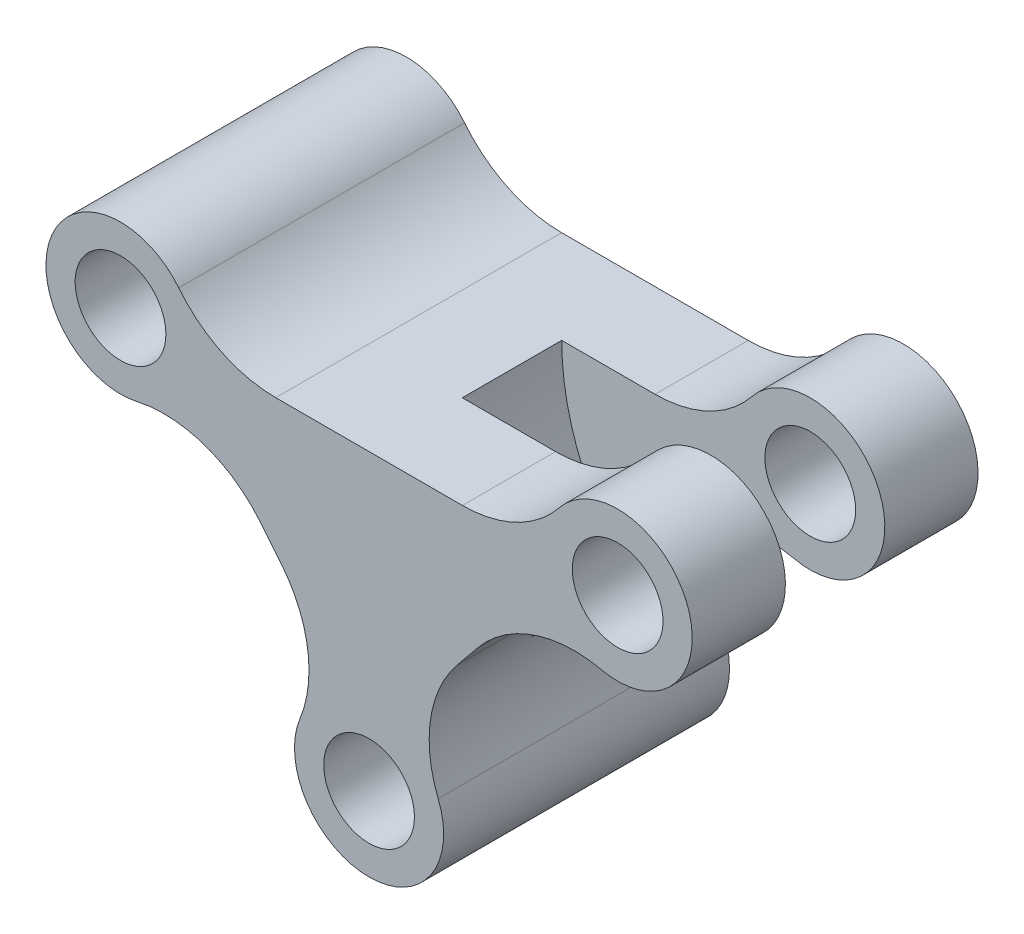
ISO-10303-21;
HEADER;
FILE_DESCRIPTION(('STEP AP214'),'2;1');
FILE_NAME('part.step','',(''),(''),'','','');
FILE_SCHEMA(('AUTOMOTIVE_DESIGN { 1 0 10303 214 1 1 1 1 }'));
ENDSEC;
DATA;
#1=APPLICATION_CONTEXT('core data for automotive mechanical design processes');
#2=APPLICATION_PROTOCOL_DEFINITION('international standard','automotive_design',2000,#1);
#3=PRODUCT_CONTEXT('',#1,'mechanical');
#4=PRODUCT('Part','Part','',(#3));
#5=PRODUCT_RELATED_PRODUCT_CATEGORY('part','',(#4));
#6=PRODUCT_DEFINITION_FORMATION('','',#4);
#7=PRODUCT_DEFINITION_CONTEXT('part definition',#1,'design');
#8=PRODUCT_DEFINITION('design','',#6,#7);
#9=PRODUCT_DEFINITION_SHAPE('','',#8);
#10=(LENGTH_UNIT() NAMED_UNIT(*) SI_UNIT(.MILLI.,.METRE.));
#11=(NAMED_UNIT(*) PLANE_ANGLE_UNIT() SI_UNIT($,.RADIAN.));
#12=(NAMED_UNIT(*) SI_UNIT($,.STERADIAN.) SOLID_ANGLE_UNIT());
#13=UNCERTAINTY_MEASURE_WITH_UNIT(LENGTH_MEASURE(1.E-05),#10,'distance_accuracy_value','');
#14=(GEOMETRIC_REPRESENTATION_CONTEXT(3) GLOBAL_UNCERTAINTY_ASSIGNED_CONTEXT((#13)) GLOBAL_UNIT_ASSIGNED_CONTEXT((#10,
#11,#12)) REPRESENTATION_CONTEXT('',''));
#15=CARTESIAN_POINT('',(0.,0.,0.));
#16=DIRECTION('',(0.,0.,1.));
#17=DIRECTION('',(1.,0.,0.));
#18=AXIS2_PLACEMENT_3D('',#15,#16,#17);
#19=CARTESIAN_POINT('',(2.45008972423379,-2.00294834956112,11.5));
#20=DIRECTION('',(0.774215945384604,-0.632921535351914,0.));
#21=DIRECTION('',(0.632921535351914,0.774215945384604,0.));
#22=AXIS2_PLACEMENT_3D('',#19,#20,#21);
#23=PLANE('',#22);
#24=DIRECTION('',(-0.632921535351914,-0.774215945384604,0.));
#25=VECTOR('',#24,1.);
#26=CARTESIAN_POINT('',(2.45008972423379,-2.00294834956112,7.75));
#27=LINE('',#26,#25);
#28=CARTESIAN_POINT('',(4.38022113462885,0.358068666212658,7.75));
#29=VERTEX_POINT('',#28);
#30=CARTESIAN_POINT('',(3.54594958364345,-0.662446992485075,7.75));
#31=VERTEX_POINT('',#30);
#32=EDGE_CURVE('E549',#29,#31,#27,.T.);
#33=ORIENTED_EDGE('',*,*,#32,.F.);
#34=DIRECTION('',(0.,0.,-1.));
#35=VECTOR('',#34,1.);
#36=CARTESIAN_POINT('',(4.38022113462885,0.358068666212658,11.5));
#37=LINE('',#36,#35);
#38=CARTESIAN_POINT('',(4.38022113462885,0.358068666212658,11.5));
#39=VERTEX_POINT('',#38);
#40=EDGE_CURVE('E429',#29,#39,#37,.F.);
#41=ORIENTED_EDGE('',*,*,#40,.T.);
#42=DIRECTION('',(-0.632921535351914,-0.774215945384604,0.));
#43=VECTOR('',#42,1.);
#44=CARTESIAN_POINT('',(2.45008972423379,-2.00294834956112,11.5));
#45=LINE('',#44,#43);
#46=CARTESIAN_POINT('',(3.54594958364345,-0.662446992485075,11.5));
#47=VERTEX_POINT('',#46);
#48=EDGE_CURVE('E520',#39,#47,#45,.T.);
#49=ORIENTED_EDGE('',*,*,#48,.T.);
#50=DIRECTION('',(0.,0.,-1.));
#51=VECTOR('',#50,1.);
#52=CARTESIAN_POINT('',(3.54594958364345,-0.662446992485075,11.5));
#53=LINE('',#52,#51);
#54=EDGE_CURVE('E426',#47,#31,#53,.T.);
#55=ORIENTED_EDGE('',*,*,#54,.T.);
#56=EDGE_LOOP('',(#33,#41,#49,#55));
#57=FACE_BOUND('',#56,.T.);
#58=ADVANCED_FACE('F235',(#57),#23,.T.);
#59=CARTESIAN_POINT('',(10.,5.,11.5));
#60=DIRECTION('',(0.,0.,-1.));
#61=DIRECTION('',(-1.,0.,0.));
#62=AXIS2_PLACEMENT_3D('',#59,#60,#61);
#63=CYLINDRICAL_SURFACE('',#62,1.825);
#64=CARTESIAN_POINT('',(10.,5.,0.));
#65=DIRECTION('',(0.,0.,1.));
#66=DIRECTION('',(1.,0.,0.));
#67=AXIS2_PLACEMENT_3D('',#64,#65,#66);
#68=CIRCLE('',#67,1.825);
#69=CARTESIAN_POINT('',(11.825,5.,0.));
#70=VERTEX_POINT('',#69);
#71=EDGE_CURVE('E510',#70,#70,#68,.T.);
#72=ORIENTED_EDGE('',*,*,#71,.F.);
#73=EDGE_LOOP('',(#72));
#74=FACE_BOUND('',#73,.T.);
#75=CARTESIAN_POINT('',(10.,5.,3.75));
#76=DIRECTION('',(0.,0.,1.));
#77=DIRECTION('',(1.,0.,0.));
#78=AXIS2_PLACEMENT_3D('',#75,#76,#77);
#79=CIRCLE('',#78,1.825);
#80=CARTESIAN_POINT('',(11.825,5.,3.75));
#81=VERTEX_POINT('',#80);
#82=EDGE_CURVE('E590',#81,#81,#79,.T.);
#83=ORIENTED_EDGE('',*,*,#82,.T.);
#84=EDGE_LOOP('',(#83));
#85=FACE_BOUND('',#84,.T.);
#86=ADVANCED_FACE('F618',(#74,#85),#63,.F.);
#87=CARTESIAN_POINT('',(10.,5.,11.5));
#88=DIRECTION('',(0.,0.,-1.));
#89=DIRECTION('',(-1.,0.,0.));
#90=AXIS2_PLACEMENT_3D('',#87,#88,#89);
#91=CYLINDRICAL_SURFACE('',#90,3.);
#92=CARTESIAN_POINT('',(10.,5.,0.));
#93=DIRECTION('',(0.,0.,1.));
#94=DIRECTION('',(1.,0.,0.));
#95=AXIS2_PLACEMENT_3D('',#92,#93,#94);
#96=CIRCLE('',#95,3.);
#97=CARTESIAN_POINT('',(9.34423782308195,2.07254787104491,0.));
#98=VERTEX_POINT('',#97);
#99=CARTESIAN_POINT('',(7.6581257506006,6.875,0.));
#100=VERTEX_POINT('',#99);
#101=EDGE_CURVE('E474',#98,#100,#96,.T.);
#102=ORIENTED_EDGE('',*,*,#101,.T.);
#103=DIRECTION('',(0.,0.,-1.));
#104=VECTOR('',#103,1.);
#105=CARTESIAN_POINT('',(7.6581257506006,6.875,11.5));
#106=LINE('',#105,#104);
#107=CARTESIAN_POINT('',(7.6581257506006,6.875,3.75));
#108=VERTEX_POINT('',#107);
#109=EDGE_CURVE('E466',#100,#108,#106,.F.);
#110=ORIENTED_EDGE('',*,*,#109,.T.);
#111=CARTESIAN_POINT('',(10.,5.,3.75));
#112=DIRECTION('',(0.,0.,1.));
#113=DIRECTION('',(1.,0.,0.));
#114=AXIS2_PLACEMENT_3D('',#111,#112,#113);
#115=CIRCLE('',#114,3.);
#116=CARTESIAN_POINT('',(9.34423782308195,2.07254787104491,3.75));
#117=VERTEX_POINT('',#116);
#118=EDGE_CURVE('E398',#117,#108,#115,.T.);
#119=ORIENTED_EDGE('',*,*,#118,.F.);
#120=DIRECTION('',(0.,0.,-1.));
#121=VECTOR('',#120,1.);
#122=CARTESIAN_POINT('',(9.34423782308195,2.07254787104491,11.5));
#123=LINE('',#122,#121);
#124=EDGE_CURVE('E463',#117,#98,#123,.T.);
#125=ORIENTED_EDGE('',*,*,#124,.T.);
#126=EDGE_LOOP('',(#102,#110,#119,#125));
#127=FACE_BOUND('',#126,.T.);
#128=ADVANCED_FACE('F480',(#127),#91,.T.);
#129=CARTESIAN_POINT('',(0.,0.,11.5));
#130=DIRECTION('',(0.,0.,1.));
#131=DIRECTION('',(1.,0.,0.));
#132=AXIS2_PLACEMENT_3D('',#129,#130,#131);
#133=PLANE('',#132);
#134=CARTESIAN_POINT('',(-10.,5.,11.5));
#135=DIRECTION('',(0.,0.,1.));
#136=DIRECTION('',(1.,0.,0.));
#137=AXIS2_PLACEMENT_3D('',#134,#135,#136);
#138=CIRCLE('',#137,1.825);
#139=CARTESIAN_POINT('',(-8.175,5.,11.5));
#140=VERTEX_POINT('',#139);
#141=EDGE_CURVE('E515',#140,#140,#138,.T.);
#142=ORIENTED_EDGE('',*,*,#141,.F.);
#143=EDGE_LOOP('',(#142));
#144=FACE_BOUND('',#143,.T.);
#145=CARTESIAN_POINT('',(10.,5.,11.5));
#146=DIRECTION('',(0.,0.,1.));
#147=DIRECTION('',(1.,0.,0.));
#148=AXIS2_PLACEMENT_3D('',#145,#146,#147);
#149=CIRCLE('',#148,1.825);
#150=CARTESIAN_POINT('',(11.825,5.,11.5));
#151=VERTEX_POINT('',#150);
#152=EDGE_CURVE('E484',#151,#151,#149,.T.);
#153=ORIENTED_EDGE('',*,*,#152,.F.);
#154=EDGE_LOOP('',(#153));
#155=FACE_BOUND('',#154,.T.);
#156=CARTESIAN_POINT('',(0.,-6.825,11.5));
#157=DIRECTION('',(0.,0.,1.));
#158=DIRECTION('',(1.,0.,0.));
#159=AXIS2_PLACEMENT_3D('',#156,#157,#158);
#160=CIRCLE('',#159,1.825);
#161=CARTESIAN_POINT('',(1.825,-6.825,11.5));
#162=VERTEX_POINT('',#161);
#163=EDGE_CURVE('E490',#162,#162,#160,.T.);
#164=ORIENTED_EDGE('',*,*,#163,.F.);
#165=EDGE_LOOP('',(#164));
#166=FACE_BOUND('',#165,.T.);
#167=DIRECTION('',(-0.632921535351914,0.774215945384604,0.));
#168=VECTOR('',#167,1.);
#169=CARTESIAN_POINT('',(-2.45008972423379,-2.00294834956112,11.5));
#170=LINE('',#169,#168);
#171=CARTESIAN_POINT('',(-3.54594958364345,-0.662446992485075,11.5));
#172=VERTEX_POINT('',#171);
#173=CARTESIAN_POINT('',(-4.38022113462885,0.358068666212657,11.5));
#174=VERTEX_POINT('',#173);
#175=EDGE_CURVE('E559',#172,#174,#170,.T.);
#176=ORIENTED_EDGE('',*,*,#175,.F.);
#177=CARTESIAN_POINT('',(-7.41702931056647,-3.82705466924464,11.5));
#178=DIRECTION('',(0.,0.,1.));
#179=DIRECTION('',(1.,0.,0.));
#180=AXIS2_PLACEMENT_3D('',#177,#178,#179);
#181=CIRCLE('',#180,5.);
#182=CARTESIAN_POINT('',(-2.78138599146243,-5.70077050096674,11.5));
#183=VERTEX_POINT('',#182);
#184=EDGE_CURVE('E441',#172,#183,#181,.F.);
#185=ORIENTED_EDGE('',*,*,#184,.T.);
#186=CARTESIAN_POINT('',(0.,-6.825,11.5));
#187=DIRECTION('',(0.,0.,1.));
#188=DIRECTION('',(1.,0.,0.));
#189=AXIS2_PLACEMENT_3D('',#186,#187,#188);
#190=CIRCLE('',#189,3.);
#191=CARTESIAN_POINT('',(2.78138599146243,-5.70077050096674,11.5));
#192=VERTEX_POINT('',#191);
#193=EDGE_CURVE('E524',#183,#192,#190,.T.);
#194=ORIENTED_EDGE('',*,*,#193,.T.);
#195=CARTESIAN_POINT('',(7.41702931056647,-3.82705466924464,11.5));
#196=DIRECTION('',(0.,0.,1.));
#197=DIRECTION('',(1.,0.,0.));
#198=AXIS2_PLACEMENT_3D('',#195,#196,#197);
#199=CIRCLE('',#198,5.);
#200=EDGE_CURVE('E459',#192,#47,#199,.F.);
#201=ORIENTED_EDGE('',*,*,#200,.T.);
#202=ORIENTED_EDGE('',*,*,#48,.F.);
#203=CARTESIAN_POINT('',(8.25130086155187,-2.80653901054691,11.5));
#204=DIRECTION('',(0.,0.,1.));
#205=DIRECTION('',(1.,0.,0.));
#206=AXIS2_PLACEMENT_3D('',#203,#204,#205);
#207=CIRCLE('',#206,5.);
#208=CARTESIAN_POINT('',(9.34423782308195,2.07254787104491,11.5));
#209=VERTEX_POINT('',#208);
#210=EDGE_CURVE('E445',#39,#209,#207,.F.);
#211=ORIENTED_EDGE('',*,*,#210,.T.);
#212=CARTESIAN_POINT('',(10.,5.,11.5));
#213=DIRECTION('',(0.,0.,1.));
#214=DIRECTION('',(1.,0.,0.));
#215=AXIS2_PLACEMENT_3D('',#212,#213,#214);
#216=CIRCLE('',#215,3.);
#217=CARTESIAN_POINT('',(7.6581257506006,6.875,11.5));
#218=VERTEX_POINT('',#217);
#219=EDGE_CURVE('E483',#209,#218,#216,.T.);
#220=ORIENTED_EDGE('',*,*,#219,.T.);
#221=CARTESIAN_POINT('',(3.75500200160161,10.,11.5));
#222=DIRECTION('',(0.,0.,1.));
#223=DIRECTION('',(1.,0.,0.));
#224=AXIS2_PLACEMENT_3D('',#221,#222,#223);
#225=CIRCLE('',#224,5.);
#226=CARTESIAN_POINT('',(3.75500200160161,5.,11.5));
#227=VERTEX_POINT('',#226);
#228=EDGE_CURVE('E449',#218,#227,#225,.F.);
#229=ORIENTED_EDGE('',*,*,#228,.T.);
#230=DIRECTION('',(1.,0.,0.));
#231=VECTOR('',#230,1.);
#232=CARTESIAN_POINT('',(0.,5.,11.5));
#233=LINE('',#232,#231);
#234=CARTESIAN_POINT('',(-3.7550020016016,5.,11.5));
#235=VERTEX_POINT('',#234);
#236=EDGE_CURVE('E504',#235,#227,#233,.T.);
#237=ORIENTED_EDGE('',*,*,#236,.F.);
#238=CARTESIAN_POINT('',(-3.7550020016016,10.,11.5));
#239=DIRECTION('',(0.,0.,1.));
#240=DIRECTION('',(1.,0.,0.));
#241=AXIS2_PLACEMENT_3D('',#238,#239,#240);
#242=CIRCLE('',#241,5.);
#243=CARTESIAN_POINT('',(-7.6581257506006,6.875,11.5));
#244=VERTEX_POINT('',#243);
#245=EDGE_CURVE('E433',#235,#244,#242,.F.);
#246=ORIENTED_EDGE('',*,*,#245,.T.);
#247=CARTESIAN_POINT('',(-10.,5.,11.5));
#248=DIRECTION('',(0.,0.,1.));
#249=DIRECTION('',(1.,0.,0.));
#250=AXIS2_PLACEMENT_3D('',#247,#248,#249);
#251=CIRCLE('',#250,3.);
#252=CARTESIAN_POINT('',(-9.34423782308195,2.07254787104491,11.5));
#253=VERTEX_POINT('',#252);
#254=EDGE_CURVE('E502',#244,#253,#251,.T.);
#255=ORIENTED_EDGE('',*,*,#254,.T.);
#256=CARTESIAN_POINT('',(-8.25130086155187,-2.80653901054691,11.5));
#257=DIRECTION('',(0.,0.,1.));
#258=DIRECTION('',(1.,0.,0.));
#259=AXIS2_PLACEMENT_3D('',#256,#257,#258);
#260=CIRCLE('',#259,5.);
#261=EDGE_CURVE('E437',#253,#174,#260,.F.);
#262=ORIENTED_EDGE('',*,*,#261,.T.);
#263=EDGE_LOOP('',(#176,#185,#194,#201,#202,#211,#220,#229,#237,#246,#255,#262));
#264=FACE_BOUND('',#263,.T.);
#265=ADVANCED_FACE('F501',(#144,#155,#166,#264),#133,.T.);
#266=CARTESIAN_POINT('',(0.,0.,0.));
#267=DIRECTION('',(0.,0.,1.));
#268=DIRECTION('',(1.,0.,0.));
#269=AXIS2_PLACEMENT_3D('',#266,#267,#268);
#270=PLANE('',#269);
#271=CARTESIAN_POINT('',(-10.,5.,0.));
#272=DIRECTION('',(0.,0.,1.));
#273=DIRECTION('',(1.,0.,0.));
#274=AXIS2_PLACEMENT_3D('',#271,#272,#273);
#275=CIRCLE('',#274,1.825);
#276=CARTESIAN_POINT('',(-8.175,5.,0.));
#277=VERTEX_POINT('',#276);
#278=EDGE_CURVE('E518',#277,#277,#275,.T.);
#279=ORIENTED_EDGE('',*,*,#278,.T.);
#280=EDGE_LOOP('',(#279));
#281=FACE_BOUND('',#280,.T.);
#282=ORIENTED_EDGE('',*,*,#71,.T.);
#283=EDGE_LOOP('',(#282));
#284=FACE_BOUND('',#283,.T.);
#285=CARTESIAN_POINT('',(0.,-6.825,0.));
#286=DIRECTION('',(0.,0.,1.));
#287=DIRECTION('',(1.,0.,0.));
#288=AXIS2_PLACEMENT_3D('',#285,#286,#287);
#289=CIRCLE('',#288,1.825);
#290=CARTESIAN_POINT('',(1.825,-6.825,0.));
#291=VERTEX_POINT('',#290);
#292=EDGE_CURVE('E528',#291,#291,#289,.T.);
#293=ORIENTED_EDGE('',*,*,#292,.T.);
#294=EDGE_LOOP('',(#293));
#295=FACE_BOUND('',#294,.T.);
#296=ORIENTED_EDGE('',*,*,#101,.F.);
#297=CARTESIAN_POINT('',(8.25130086155187,-2.80653901054691,0.));
#298=DIRECTION('',(0.,0.,1.));
#299=DIRECTION('',(1.,0.,0.));
#300=AXIS2_PLACEMENT_3D('',#297,#298,#299);
#301=CIRCLE('',#300,5.);
#302=CARTESIAN_POINT('',(4.38022113462885,0.358068666212658,0.));
#303=VERTEX_POINT('',#302);
#304=EDGE_CURVE('E243',#98,#303,#301,.T.);
#305=ORIENTED_EDGE('',*,*,#304,.T.);
#306=DIRECTION('',(-0.632921535351914,-0.774215945384604,0.));
#307=VECTOR('',#306,1.);
#308=CARTESIAN_POINT('',(2.45008972423379,-2.00294834956112,0.));
#309=LINE('',#308,#307);
#310=CARTESIAN_POINT('',(3.54594958364345,-0.662446992485075,0.));
#311=VERTEX_POINT('',#310);
#312=EDGE_CURVE('E491',#303,#311,#309,.T.);
#313=ORIENTED_EDGE('',*,*,#312,.T.);
#314=CARTESIAN_POINT('',(7.41702931056647,-3.82705466924464,0.));
#315=DIRECTION('',(0.,0.,1.));
#316=DIRECTION('',(1.,0.,0.));
#317=AXIS2_PLACEMENT_3D('',#314,#315,#316);
#318=CIRCLE('',#317,5.);
#319=CARTESIAN_POINT('',(2.78138599146243,-5.70077050096674,0.));
#320=VERTEX_POINT('',#319);
#321=EDGE_CURVE('E457',#311,#320,#318,.T.);
#322=ORIENTED_EDGE('',*,*,#321,.T.);
#323=CARTESIAN_POINT('',(0.,-6.825,0.));
#324=DIRECTION('',(0.,0.,1.));
#325=DIRECTION('',(1.,0.,0.));
#326=AXIS2_PLACEMENT_3D('',#323,#324,#325);
#327=CIRCLE('',#326,3.);
#328=CARTESIAN_POINT('',(-2.78138599146243,-5.70077050096674,0.));
#329=VERTEX_POINT('',#328);
#330=EDGE_CURVE('E534',#329,#320,#327,.T.);
#331=ORIENTED_EDGE('',*,*,#330,.F.);
#332=CARTESIAN_POINT('',(-7.41702931056647,-3.82705466924464,0.));
#333=DIRECTION('',(0.,0.,1.));
#334=DIRECTION('',(1.,0.,0.));
#335=AXIS2_PLACEMENT_3D('',#332,#333,#334);
#336=CIRCLE('',#335,5.);
#337=CARTESIAN_POINT('',(-3.54594958364345,-0.662446992485075,0.));
#338=VERTEX_POINT('',#337);
#339=EDGE_CURVE('E439',#329,#338,#336,.T.);
#340=ORIENTED_EDGE('',*,*,#339,.T.);
#341=DIRECTION('',(-0.632921535351914,0.774215945384604,0.));
#342=VECTOR('',#341,1.);
#343=CARTESIAN_POINT('',(-2.45008972423379,-2.00294834956112,0.));
#344=LINE('',#343,#342);
#345=CARTESIAN_POINT('',(-4.38022113462885,0.358068666212657,0.));
#346=VERTEX_POINT('',#345);
#347=EDGE_CURVE('E531',#338,#346,#344,.T.);
#348=ORIENTED_EDGE('',*,*,#347,.T.);
#349=CARTESIAN_POINT('',(-8.25130086155187,-2.80653901054691,0.));
#350=DIRECTION('',(0.,0.,1.));
#351=DIRECTION('',(1.,0.,0.));
#352=AXIS2_PLACEMENT_3D('',#349,#350,#351);
#353=CIRCLE('',#352,5.);
#354=CARTESIAN_POINT('',(-9.34423782308195,2.07254787104491,0.));
#355=VERTEX_POINT('',#354);
#356=EDGE_CURVE('E435',#346,#355,#353,.T.);
#357=ORIENTED_EDGE('',*,*,#356,.T.);
#358=CARTESIAN_POINT('',(-10.,5.,0.));
#359=DIRECTION('',(0.,0.,1.));
#360=DIRECTION('',(1.,0.,0.));
#361=AXIS2_PLACEMENT_3D('',#358,#359,#360);
#362=CIRCLE('',#361,3.);
#363=CARTESIAN_POINT('',(-7.6581257506006,6.875,0.));
#364=VERTEX_POINT('',#363);
#365=EDGE_CURVE('E511',#364,#355,#362,.T.);
#366=ORIENTED_EDGE('',*,*,#365,.F.);
#367=CARTESIAN_POINT('',(-3.7550020016016,10.,0.));
#368=DIRECTION('',(0.,0.,1.));
#369=DIRECTION('',(1.,0.,0.));
#370=AXIS2_PLACEMENT_3D('',#367,#368,#369);
#371=CIRCLE('',#370,5.);
#372=CARTESIAN_POINT('',(-3.7550020016016,5.,0.));
#373=VERTEX_POINT('',#372);
#374=EDGE_CURVE('E431',#364,#373,#371,.T.);
#375=ORIENTED_EDGE('',*,*,#374,.T.);
#376=DIRECTION('',(1.,0.,0.));
#377=VECTOR('',#376,1.);
#378=CARTESIAN_POINT('',(0.,5.,0.));
#379=LINE('',#378,#377);
#380=CARTESIAN_POINT('',(3.75500200160161,5.,0.));
#381=VERTEX_POINT('',#380);
#382=EDGE_CURVE('E476',#373,#381,#379,.T.);
#383=ORIENTED_EDGE('',*,*,#382,.T.);
#384=CARTESIAN_POINT('',(3.75500200160161,10.,0.));
#385=DIRECTION('',(0.,0.,1.));
#386=DIRECTION('',(1.,0.,0.));
#387=AXIS2_PLACEMENT_3D('',#384,#385,#386);
#388=CIRCLE('',#387,5.);
#389=EDGE_CURVE('E469',#381,#100,#388,.T.);
#390=ORIENTED_EDGE('',*,*,#389,.T.);
#391=EDGE_LOOP('',(#296,#305,#313,#322,#331,#340,#348,#357,#366,#375,#383,#390));
#392=FACE_BOUND('',#391,.T.);
#393=ADVANCED_FACE('F473',(#281,#284,#295,#392),#270,.F.);
#394=CARTESIAN_POINT('',(0.,-6.825,11.5));
#395=DIRECTION('',(0.,0.,-1.));
#396=DIRECTION('',(-1.,0.,0.));
#397=AXIS2_PLACEMENT_3D('',#394,#395,#396);
#398=CYLINDRICAL_SURFACE('',#397,1.825);
#399=ORIENTED_EDGE('',*,*,#292,.F.);
#400=EDGE_LOOP('',(#399));
#401=FACE_BOUND('',#400,.T.);
#402=ORIENTED_EDGE('',*,*,#163,.T.);
#403=EDGE_LOOP('',(#402));
#404=FACE_BOUND('',#403,.T.);
#405=ADVANCED_FACE('F634',(#401,#404),#398,.F.);
#406=CARTESIAN_POINT('',(0.,-6.825,11.5));
#407=DIRECTION('',(0.,0.,-1.));
#408=DIRECTION('',(-1.,0.,0.));
#409=AXIS2_PLACEMENT_3D('',#406,#407,#408);
#410=CYLINDRICAL_SURFACE('',#409,3.);
#411=ORIENTED_EDGE('',*,*,#193,.F.);
#412=DIRECTION('',(0.,0.,-1.));
#413=VECTOR('',#412,1.);
#414=CARTESIAN_POINT('',(-2.78138599146243,-5.70077050096674,11.5));
#415=LINE('',#414,#413);
#416=EDGE_CURVE('E415',#183,#329,#415,.T.);
#417=ORIENTED_EDGE('',*,*,#416,.T.);
#418=ORIENTED_EDGE('',*,*,#330,.T.);
#419=DIRECTION('',(0.,0.,-1.));
#420=VECTOR('',#419,1.);
#421=CARTESIAN_POINT('',(2.78138599146243,-5.70077050096674,11.5));
#422=LINE('',#421,#420);
#423=EDGE_CURVE('E413',#320,#192,#422,.F.);
#424=ORIENTED_EDGE('',*,*,#423,.T.);
#425=EDGE_LOOP('',(#411,#417,#418,#424));
#426=FACE_BOUND('',#425,.T.);
#427=ADVANCED_FACE('F599',(#426),#410,.T.);
#428=ORIENTED_EDGE('',*,*,#312,.F.);
#429=DIRECTION('',(0.,0.,-1.));
#430=VECTOR('',#429,1.);
#431=CARTESIAN_POINT('',(4.38022113462885,0.358068666212658,11.5));
#432=LINE('',#431,#430);
#433=CARTESIAN_POINT('',(4.38022113462885,0.358068666212658,3.75));
#434=VERTEX_POINT('',#433);
#435=EDGE_CURVE('E256',#303,#434,#432,.F.);
#436=ORIENTED_EDGE('',*,*,#435,.T.);
#437=DIRECTION('',(-0.632921535351914,-0.774215945384604,0.));
#438=VECTOR('',#437,1.);
#439=CARTESIAN_POINT('',(2.45008972423379,-2.00294834956112,3.75));
#440=LINE('',#439,#438);
#441=CARTESIAN_POINT('',(3.54594958364345,-0.662446992485075,3.75));
#442=VERTEX_POINT('',#441);
#443=EDGE_CURVE('E376',#434,#442,#440,.T.);
#444=ORIENTED_EDGE('',*,*,#443,.T.);
#445=DIRECTION('',(0.,0.,-1.));
#446=VECTOR('',#445,1.);
#447=CARTESIAN_POINT('',(3.54594958364345,-0.662446992485075,11.5));
#448=LINE('',#447,#446);
#449=EDGE_CURVE('E423',#442,#311,#448,.T.);
#450=ORIENTED_EDGE('',*,*,#449,.T.);
#451=EDGE_LOOP('',(#428,#436,#444,#450));
#452=FACE_BOUND('',#451,.T.);
#453=ADVANCED_FACE('F595',(#452),#23,.T.);
#454=CARTESIAN_POINT('',(0.,5.,11.5));
#455=DIRECTION('',(0.,1.,0.));
#456=DIRECTION('',(-1.,0.,0.));
#457=AXIS2_PLACEMENT_3D('',#454,#455,#456);
#458=PLANE('',#457);
#459=DIRECTION('',(1.,0.,0.));
#460=VECTOR('',#459,1.);
#461=CARTESIAN_POINT('',(0.,5.,3.75));
#462=LINE('',#461,#460);
#463=CARTESIAN_POINT('',(0.,5.,3.75));
#464=VERTEX_POINT('',#463);
#465=CARTESIAN_POINT('',(3.75500200160161,5.,3.75));
#466=VERTEX_POINT('',#465);
#467=EDGE_CURVE('E363',#464,#466,#462,.T.);
#468=ORIENTED_EDGE('',*,*,#467,.T.);
#469=DIRECTION('',(0.,0.,-1.));
#470=VECTOR('',#469,1.);
#471=CARTESIAN_POINT('',(3.75500200160161,5.,11.5));
#472=LINE('',#471,#470);
#473=EDGE_CURVE('E461',#466,#381,#472,.T.);
#474=ORIENTED_EDGE('',*,*,#473,.T.);
#475=ORIENTED_EDGE('',*,*,#382,.F.);
#476=DIRECTION('',(0.,0.,-1.));
#477=VECTOR('',#476,1.);
#478=CARTESIAN_POINT('',(-3.7550020016016,5.,11.5));
#479=LINE('',#478,#477);
#480=EDGE_CURVE('E406',#373,#235,#479,.F.);
#481=ORIENTED_EDGE('',*,*,#480,.T.);
#482=ORIENTED_EDGE('',*,*,#236,.T.);
#483=DIRECTION('',(0.,0.,-1.));
#484=VECTOR('',#483,1.);
#485=CARTESIAN_POINT('',(3.75500200160161,5.,11.5));
#486=LINE('',#485,#484);
#487=CARTESIAN_POINT('',(3.75500200160161,5.,7.75));
#488=VERTEX_POINT('',#487);
#489=EDGE_CURVE('E404',#227,#488,#486,.T.);
#490=ORIENTED_EDGE('',*,*,#489,.T.);
#491=DIRECTION('',(1.,0.,0.));
#492=VECTOR('',#491,1.);
#493=CARTESIAN_POINT('',(0.,5.,7.75));
#494=LINE('',#493,#492);
#495=CARTESIAN_POINT('',(0.,5.,7.75));
#496=VERTEX_POINT('',#495);
#497=EDGE_CURVE('E391',#496,#488,#494,.T.);
#498=ORIENTED_EDGE('',*,*,#497,.F.);
#499=DIRECTION('',(0.,0.,-1.));
#500=VECTOR('',#499,1.);
#501=CARTESIAN_POINT('',(0.,5.,7.75));
#502=LINE('',#501,#500);
#503=EDGE_CURVE('E381',#496,#464,#502,.T.);
#504=ORIENTED_EDGE('',*,*,#503,.T.);
#505=EDGE_LOOP('',(#468,#474,#475,#481,#482,#490,#498,#504));
#506=FACE_BOUND('',#505,.T.);
#507=ADVANCED_FACE('F388',(#506),#458,.T.);
#508=CARTESIAN_POINT('',(-2.45008972423379,-2.00294834956112,11.5));
#509=DIRECTION('',(-0.774215945384604,-0.632921535351914,0.));
#510=DIRECTION('',(0.632921535351914,-0.774215945384604,0.));
#511=AXIS2_PLACEMENT_3D('',#508,#509,#510);
#512=PLANE('',#511);
#513=ORIENTED_EDGE('',*,*,#175,.T.);
#514=DIRECTION('',(0.,0.,-1.));
#515=VECTOR('',#514,1.);
#516=CARTESIAN_POINT('',(-4.38022113462885,0.358068666212656,11.5));
#517=LINE('',#516,#515);
#518=EDGE_CURVE('E410',#174,#346,#517,.T.);
#519=ORIENTED_EDGE('',*,*,#518,.T.);
#520=ORIENTED_EDGE('',*,*,#347,.F.);
#521=DIRECTION('',(0.,0.,-1.));
#522=VECTOR('',#521,1.);
#523=CARTESIAN_POINT('',(-3.54594958364345,-0.662446992485075,11.5));
#524=LINE('',#523,#522);
#525=EDGE_CURVE('E408',#338,#172,#524,.F.);
#526=ORIENTED_EDGE('',*,*,#525,.T.);
#527=EDGE_LOOP('',(#513,#519,#520,#526));
#528=FACE_BOUND('',#527,.T.);
#529=ADVANCED_FACE('F605',(#528),#512,.T.);
#530=CARTESIAN_POINT('',(10.,5.,7.75));
#531=DIRECTION('',(0.,0.,1.));
#532=DIRECTION('',(1.,0.,0.));
#533=AXIS2_PLACEMENT_3D('',#530,#531,#532);
#534=CIRCLE('',#533,1.825);
#535=CARTESIAN_POINT('',(11.825,5.,7.75));
#536=VERTEX_POINT('',#535);
#537=EDGE_CURVE('E545',#536,#536,#534,.T.);
#538=ORIENTED_EDGE('',*,*,#537,.F.);
#539=EDGE_LOOP('',(#538));
#540=FACE_BOUND('',#539,.T.);
#541=ORIENTED_EDGE('',*,*,#152,.T.);
#542=EDGE_LOOP('',(#541));
#543=FACE_BOUND('',#542,.T.);
#544=ADVANCED_FACE('F625',(#540,#543),#63,.F.);
#545=ORIENTED_EDGE('',*,*,#219,.F.);
#546=DIRECTION('',(0.,0.,-1.));
#547=VECTOR('',#546,1.);
#548=CARTESIAN_POINT('',(9.34423782308195,2.07254787104491,11.5));
#549=LINE('',#548,#547);
#550=CARTESIAN_POINT('',(9.34423782308195,2.07254787104491,7.75));
#551=VERTEX_POINT('',#550);
#552=EDGE_CURVE('E420',#209,#551,#549,.T.);
#553=ORIENTED_EDGE('',*,*,#552,.T.);
#554=CARTESIAN_POINT('',(10.,5.,7.75));
#555=DIRECTION('',(0.,0.,1.));
#556=DIRECTION('',(1.,0.,0.));
#557=AXIS2_PLACEMENT_3D('',#554,#555,#556);
#558=CIRCLE('',#557,3.);
#559=CARTESIAN_POINT('',(7.6581257506006,6.875,7.75));
#560=VERTEX_POINT('',#559);
#561=EDGE_CURVE('E393',#551,#560,#558,.T.);
#562=ORIENTED_EDGE('',*,*,#561,.T.);
#563=DIRECTION('',(0.,0.,-1.));
#564=VECTOR('',#563,1.);
#565=CARTESIAN_POINT('',(7.6581257506006,6.875,11.5));
#566=LINE('',#565,#564);
#567=EDGE_CURVE('E418',#560,#218,#566,.F.);
#568=ORIENTED_EDGE('',*,*,#567,.T.);
#569=EDGE_LOOP('',(#545,#553,#562,#568));
#570=FACE_BOUND('',#569,.T.);
#571=ADVANCED_FACE('F585',(#570),#91,.T.);
#572=CARTESIAN_POINT('',(-10.,5.,11.5));
#573=DIRECTION('',(0.,0.,-1.));
#574=DIRECTION('',(-1.,0.,0.));
#575=AXIS2_PLACEMENT_3D('',#572,#573,#574);
#576=CYLINDRICAL_SURFACE('',#575,1.825);
#577=ORIENTED_EDGE('',*,*,#278,.F.);
#578=EDGE_LOOP('',(#577));
#579=FACE_BOUND('',#578,.T.);
#580=ORIENTED_EDGE('',*,*,#141,.T.);
#581=EDGE_LOOP('',(#580));
#582=FACE_BOUND('',#581,.T.);
#583=ADVANCED_FACE('F633',(#579,#582),#576,.F.);
#584=CARTESIAN_POINT('',(-10.,5.,11.5));
#585=DIRECTION('',(0.,0.,-1.));
#586=DIRECTION('',(-1.,0.,0.));
#587=AXIS2_PLACEMENT_3D('',#584,#585,#586);
#588=CYLINDRICAL_SURFACE('',#587,3.);
#589=ORIENTED_EDGE('',*,*,#254,.F.);
#590=DIRECTION('',(0.,0.,-1.));
#591=VECTOR('',#590,1.);
#592=CARTESIAN_POINT('',(-7.6581257506006,6.875,11.5));
#593=LINE('',#592,#591);
#594=EDGE_CURVE('E395',#244,#364,#593,.T.);
#595=ORIENTED_EDGE('',*,*,#594,.T.);
#596=ORIENTED_EDGE('',*,*,#365,.T.);
#597=DIRECTION('',(0.,0.,-1.));
#598=VECTOR('',#597,1.);
#599=CARTESIAN_POINT('',(-9.34423782308195,2.07254787104491,11.5));
#600=LINE('',#599,#598);
#601=EDGE_CURVE('E392',#355,#253,#600,.F.);
#602=ORIENTED_EDGE('',*,*,#601,.T.);
#603=EDGE_LOOP('',(#589,#595,#596,#602));
#604=FACE_BOUND('',#603,.T.);
#605=ADVANCED_FACE('F506',(#604),#588,.T.);
#606=CARTESIAN_POINT('',(10.,5.,7.75));
#607=DIRECTION('',(0.,0.,-1.));
#608=DIRECTION('',(-1.,0.,0.));
#609=AXIS2_PLACEMENT_3D('',#606,#607,#608);
#610=CYLINDRICAL_SURFACE('',#609,10.);
#611=CARTESIAN_POINT('',(10.,5.,3.75));
#612=DIRECTION('',(0.,0.,1.));
#613=DIRECTION('',(1.,0.,0.));
#614=AXIS2_PLACEMENT_3D('',#611,#612,#613);
#615=CIRCLE('',#614,10.);
#616=CARTESIAN_POINT('',(2.79080909558462,-1.93019238576351,3.75));
#617=VERTEX_POINT('',#616);
#618=EDGE_CURVE('E367',#464,#617,#615,.T.);
#619=ORIENTED_EDGE('',*,*,#618,.F.);
#620=ORIENTED_EDGE('',*,*,#503,.F.);
#621=CARTESIAN_POINT('',(10.,5.,7.75));
#622=DIRECTION('',(0.,0.,1.));
#623=DIRECTION('',(1.,0.,0.));
#624=AXIS2_PLACEMENT_3D('',#621,#622,#623);
#625=CIRCLE('',#624,10.);
#626=CARTESIAN_POINT('',(2.79080909558462,-1.93019238576351,7.75));
#627=VERTEX_POINT('',#626);
#628=EDGE_CURVE('E377',#496,#627,#625,.T.);
#629=ORIENTED_EDGE('',*,*,#628,.T.);
#630=DIRECTION('',(0.,0.,-1.));
#631=VECTOR('',#630,1.);
#632=CARTESIAN_POINT('',(2.79080909558462,-1.93019238576351,7.75));
#633=LINE('',#632,#631);
#634=EDGE_CURVE('E384',#627,#617,#633,.T.);
#635=ORIENTED_EDGE('',*,*,#634,.T.);
#636=EDGE_LOOP('',(#619,#620,#629,#635));
#637=FACE_BOUND('',#636,.T.);
#638=ADVANCED_FACE('F380',(#637),#610,.F.);
#639=CARTESIAN_POINT('',(10.,5.,7.75));
#640=DIRECTION('',(0.,0.,1.));
#641=DIRECTION('',(1.,0.,0.));
#642=AXIS2_PLACEMENT_3D('',#639,#640,#641);
#643=PLANE('',#642);
#644=ORIENTED_EDGE('',*,*,#537,.T.);
#645=EDGE_LOOP('',(#644));
#646=FACE_BOUND('',#645,.T.);
#647=ORIENTED_EDGE('',*,*,#561,.F.);
#648=CARTESIAN_POINT('',(8.25130086155187,-2.80653901054691,7.75));
#649=DIRECTION('',(0.,0.,1.));
#650=DIRECTION('',(1.,0.,0.));
#651=AXIS2_PLACEMENT_3D('',#648,#649,#650);
#652=CIRCLE('',#651,5.);
#653=EDGE_CURVE('E443',#551,#29,#652,.T.);
#654=ORIENTED_EDGE('',*,*,#653,.T.);
#655=ORIENTED_EDGE('',*,*,#32,.T.);
#656=CARTESIAN_POINT('',(7.41702931056647,-3.82705466924464,7.75));
#657=DIRECTION('',(0.,0.,1.));
#658=DIRECTION('',(1.,0.,0.));
#659=AXIS2_PLACEMENT_3D('',#656,#657,#658);
#660=CIRCLE('',#659,5.);
#661=EDGE_CURVE('E451',#31,#627,#660,.T.);
#662=ORIENTED_EDGE('',*,*,#661,.T.);
#663=ORIENTED_EDGE('',*,*,#628,.F.);
#664=ORIENTED_EDGE('',*,*,#497,.T.);
#665=CARTESIAN_POINT('',(3.75500200160161,10.,7.75));
#666=DIRECTION('',(0.,0.,1.));
#667=DIRECTION('',(1.,0.,0.));
#668=AXIS2_PLACEMENT_3D('',#665,#666,#667);
#669=CIRCLE('',#668,5.);
#670=EDGE_CURVE('E447',#488,#560,#669,.T.);
#671=ORIENTED_EDGE('',*,*,#670,.T.);
#672=EDGE_LOOP('',(#647,#654,#655,#662,#663,#664,#671));
#673=FACE_BOUND('',#672,.T.);
#674=ADVANCED_FACE('F578',(#646,#673),#643,.F.);
#675=CARTESIAN_POINT('',(10.,5.,3.75));
#676=DIRECTION('',(0.,0.,1.));
#677=DIRECTION('',(1.,0.,0.));
#678=AXIS2_PLACEMENT_3D('',#675,#676,#677);
#679=PLANE('',#678);
#680=ORIENTED_EDGE('',*,*,#82,.F.);
#681=EDGE_LOOP('',(#680));
#682=FACE_BOUND('',#681,.T.);
#683=ORIENTED_EDGE('',*,*,#443,.F.);
#684=CARTESIAN_POINT('',(8.25130086155187,-2.80653901054691,3.75));
#685=DIRECTION('',(0.,0.,1.));
#686=DIRECTION('',(1.,0.,0.));
#687=AXIS2_PLACEMENT_3D('',#684,#685,#686);
#688=CIRCLE('',#687,5.);
#689=EDGE_CURVE('E12',#434,#117,#688,.F.);
#690=ORIENTED_EDGE('',*,*,#689,.T.);
#691=ORIENTED_EDGE('',*,*,#118,.T.);
#692=CARTESIAN_POINT('',(3.75500200160161,10.,3.75));
#693=DIRECTION('',(0.,0.,1.));
#694=DIRECTION('',(1.,0.,0.));
#695=AXIS2_PLACEMENT_3D('',#692,#693,#694);
#696=CIRCLE('',#695,5.);
#697=EDGE_CURVE('E371',#108,#466,#696,.F.);
#698=ORIENTED_EDGE('',*,*,#697,.T.);
#699=ORIENTED_EDGE('',*,*,#467,.F.);
#700=ORIENTED_EDGE('',*,*,#618,.T.);
#701=CARTESIAN_POINT('',(7.41702931056647,-3.82705466924464,3.75));
#702=DIRECTION('',(0.,0.,1.));
#703=DIRECTION('',(1.,0.,0.));
#704=AXIS2_PLACEMENT_3D('',#701,#702,#703);
#705=CIRCLE('',#704,5.);
#706=EDGE_CURVE('E455',#617,#442,#705,.F.);
#707=ORIENTED_EDGE('',*,*,#706,.T.);
#708=EDGE_LOOP('',(#683,#690,#691,#698,#699,#700,#707));
#709=FACE_BOUND('',#708,.T.);
#710=ADVANCED_FACE('F365',(#682,#709),#679,.T.);
#711=CARTESIAN_POINT('',(-3.7550020016016,10.,11.5));
#712=DIRECTION('',(0.,0.,-1.));
#713=DIRECTION('',(-1.,0.,0.));
#714=AXIS2_PLACEMENT_3D('',#711,#712,#713);
#715=CYLINDRICAL_SURFACE('',#714,5.);
#716=ORIENTED_EDGE('',*,*,#245,.F.);
#717=ORIENTED_EDGE('',*,*,#480,.F.);
#718=ORIENTED_EDGE('',*,*,#374,.F.);
#719=ORIENTED_EDGE('',*,*,#594,.F.);
#720=EDGE_LOOP('',(#716,#717,#718,#719));
#721=FACE_BOUND('',#720,.T.);
#722=ADVANCED_FACE('F495',(#721),#715,.F.);
#723=CARTESIAN_POINT('',(-8.25130086155187,-2.80653901054691,11.5));
#724=DIRECTION('',(0.,0.,-1.));
#725=DIRECTION('',(-1.,0.,0.));
#726=AXIS2_PLACEMENT_3D('',#723,#724,#725);
#727=CYLINDRICAL_SURFACE('',#726,5.);
#728=ORIENTED_EDGE('',*,*,#261,.F.);
#729=ORIENTED_EDGE('',*,*,#601,.F.);
#730=ORIENTED_EDGE('',*,*,#356,.F.);
#731=ORIENTED_EDGE('',*,*,#518,.F.);
#732=EDGE_LOOP('',(#728,#729,#730,#731));
#733=FACE_BOUND('',#732,.T.);
#734=ADVANCED_FACE('F608',(#733),#727,.F.);
#735=CARTESIAN_POINT('',(-7.41702931056647,-3.82705466924464,11.5));
#736=DIRECTION('',(0.,0.,-1.));
#737=DIRECTION('',(-1.,0.,0.));
#738=AXIS2_PLACEMENT_3D('',#735,#736,#737);
#739=CYLINDRICAL_SURFACE('',#738,5.);
#740=ORIENTED_EDGE('',*,*,#184,.F.);
#741=ORIENTED_EDGE('',*,*,#525,.F.);
#742=ORIENTED_EDGE('',*,*,#339,.F.);
#743=ORIENTED_EDGE('',*,*,#416,.F.);
#744=EDGE_LOOP('',(#740,#741,#742,#743));
#745=FACE_BOUND('',#744,.T.);
#746=ADVANCED_FACE('F601',(#745),#739,.F.);
#747=CARTESIAN_POINT('',(8.25130086155187,-2.80653901054691,11.5));
#748=DIRECTION('',(0.,0.,-1.));
#749=DIRECTION('',(-1.,0.,0.));
#750=AXIS2_PLACEMENT_3D('',#747,#748,#749);
#751=CYLINDRICAL_SURFACE('',#750,5.);
#752=ORIENTED_EDGE('',*,*,#210,.F.);
#753=ORIENTED_EDGE('',*,*,#40,.F.);
#754=ORIENTED_EDGE('',*,*,#653,.F.);
#755=ORIENTED_EDGE('',*,*,#552,.F.);
#756=EDGE_LOOP('',(#752,#753,#754,#755));
#757=FACE_BOUND('',#756,.T.);
#758=ADVANCED_FACE('F582',(#757),#751,.F.);
#759=CARTESIAN_POINT('',(3.75500200160161,10.,11.5));
#760=DIRECTION('',(0.,0.,-1.));
#761=DIRECTION('',(-1.,0.,0.));
#762=AXIS2_PLACEMENT_3D('',#759,#760,#761);
#763=CYLINDRICAL_SURFACE('',#762,5.);
#764=ORIENTED_EDGE('',*,*,#228,.F.);
#765=ORIENTED_EDGE('',*,*,#567,.F.);
#766=ORIENTED_EDGE('',*,*,#670,.F.);
#767=ORIENTED_EDGE('',*,*,#489,.F.);
#768=EDGE_LOOP('',(#764,#765,#766,#767));
#769=FACE_BOUND('',#768,.T.);
#770=ADVANCED_FACE('F589',(#769),#763,.F.);
#771=CARTESIAN_POINT('',(7.41702931056647,-3.82705466924464,11.5));
#772=DIRECTION('',(0.,0.,-1.));
#773=DIRECTION('',(-1.,0.,0.));
#774=AXIS2_PLACEMENT_3D('',#771,#772,#773);
#775=CYLINDRICAL_SURFACE('',#774,5.);
#776=ORIENTED_EDGE('',*,*,#200,.F.);
#777=ORIENTED_EDGE('',*,*,#423,.F.);
#778=ORIENTED_EDGE('',*,*,#321,.F.);
#779=ORIENTED_EDGE('',*,*,#449,.F.);
#780=ORIENTED_EDGE('',*,*,#706,.F.);
#781=ORIENTED_EDGE('',*,*,#634,.F.);
#782=ORIENTED_EDGE('',*,*,#661,.F.);
#783=ORIENTED_EDGE('',*,*,#54,.F.);
#784=EDGE_LOOP('',(#776,#777,#778,#779,#780,#781,#782,#783));
#785=FACE_BOUND('',#784,.T.);
#786=ADVANCED_FACE('F571',(#785),#775,.F.);
#787=CARTESIAN_POINT('',(3.75500200160161,10.,11.5));
#788=DIRECTION('',(0.,0.,-1.));
#789=DIRECTION('',(-1.,0.,0.));
#790=AXIS2_PLACEMENT_3D('',#787,#788,#789);
#791=CYLINDRICAL_SURFACE('',#790,5.);
#792=ORIENTED_EDGE('',*,*,#697,.F.);
#793=ORIENTED_EDGE('',*,*,#109,.F.);
#794=ORIENTED_EDGE('',*,*,#389,.F.);
#795=ORIENTED_EDGE('',*,*,#473,.F.);
#796=EDGE_LOOP('',(#792,#793,#794,#795));
#797=FACE_BOUND('',#796,.T.);
#798=ADVANCED_FACE('F486',(#797),#791,.F.);
#799=CARTESIAN_POINT('',(8.25130086155187,-2.80653901054691,11.5));
#800=DIRECTION('',(0.,0.,-1.));
#801=DIRECTION('',(-1.,0.,0.));
#802=AXIS2_PLACEMENT_3D('',#799,#800,#801);
#803=CYLINDRICAL_SURFACE('',#802,5.);
#804=ORIENTED_EDGE('',*,*,#689,.F.);
#805=ORIENTED_EDGE('',*,*,#435,.F.);
#806=ORIENTED_EDGE('',*,*,#304,.F.);
#807=ORIENTED_EDGE('',*,*,#124,.F.);
#808=EDGE_LOOP('',(#804,#805,#806,#807));
#809=FACE_BOUND('',#808,.T.);
#810=ADVANCED_FACE('F237',(#809),#803,.F.);
#811=CLOSED_SHELL('',(#58,#86,#128,#265,#393,#405,#427,#453,#507,#529,#544,#571,#583,#605,#638,
#674,#710,#722,#734,#746,#758,#770,#786,#798,#810));
#812=MANIFOLD_SOLID_BREP('B2',#811);
#813=ADVANCED_BREP_SHAPE_REPRESENTATION('',(#18,#812),#14);
#814=SHAPE_DEFINITION_REPRESENTATION(#9,#813);
ENDSEC;
END-ISO-10303-21;
